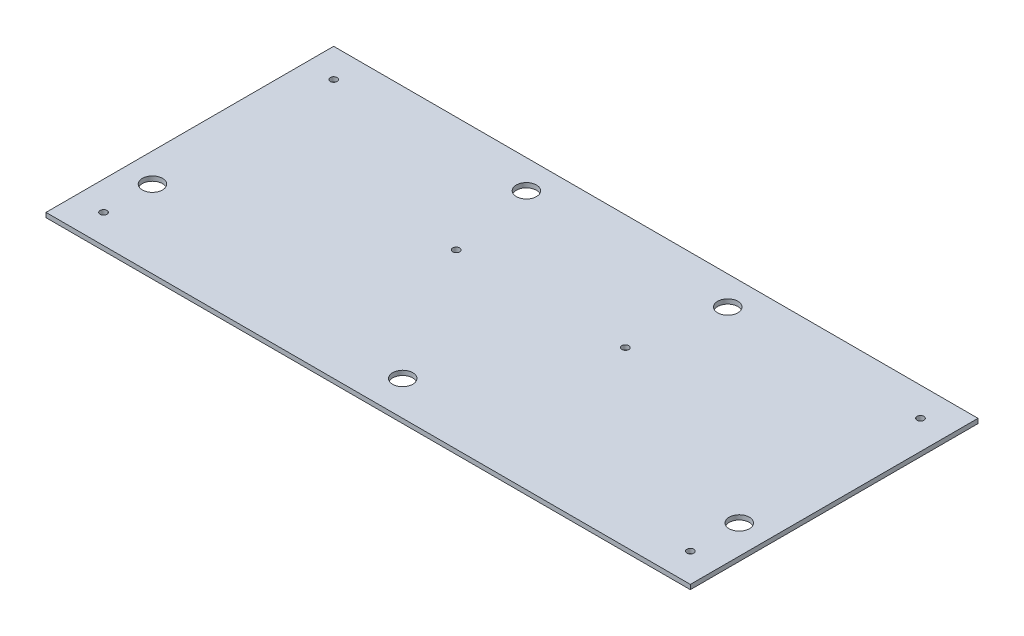
ISO-10303-21;
HEADER;
FILE_DESCRIPTION(('STEP AP214'),'2;1');
FILE_NAME('part.step','',(''),(''),'','','');
FILE_SCHEMA(('AUTOMOTIVE_DESIGN { 1 0 10303 214 1 1 1 1 }'));
ENDSEC;
DATA;
#1=APPLICATION_CONTEXT('core data for automotive mechanical design processes');
#2=APPLICATION_PROTOCOL_DEFINITION('international standard','automotive_design',2000,#1);
#3=PRODUCT_CONTEXT('',#1,'mechanical');
#4=PRODUCT('Part','Part','',(#3));
#5=PRODUCT_RELATED_PRODUCT_CATEGORY('part','',(#4));
#6=PRODUCT_DEFINITION_FORMATION('','',#4);
#7=PRODUCT_DEFINITION_CONTEXT('part definition',#1,'design');
#8=PRODUCT_DEFINITION('design','',#6,#7);
#9=PRODUCT_DEFINITION_SHAPE('','',#8);
#10=(LENGTH_UNIT() NAMED_UNIT(*) SI_UNIT(.MILLI.,.METRE.));
#11=(NAMED_UNIT(*) PLANE_ANGLE_UNIT() SI_UNIT($,.RADIAN.));
#12=(NAMED_UNIT(*) SI_UNIT($,.STERADIAN.) SOLID_ANGLE_UNIT());
#13=UNCERTAINTY_MEASURE_WITH_UNIT(LENGTH_MEASURE(1.E-05),#10,'distance_accuracy_value','');
#14=(GEOMETRIC_REPRESENTATION_CONTEXT(3) GLOBAL_UNCERTAINTY_ASSIGNED_CONTEXT((#13)) GLOBAL_UNIT_ASSIGNED_CONTEXT((#10,
#11,#12)) REPRESENTATION_CONTEXT('',''));
#15=CARTESIAN_POINT('',(0.,0.,0.));
#16=DIRECTION('',(0.,0.,1.));
#17=DIRECTION('',(1.,0.,0.));
#18=AXIS2_PLACEMENT_3D('',#15,#16,#17);
#19=CARTESIAN_POINT('',(-112.,1.6,50.));
#20=DIRECTION('',(1.,0.,0.));
#21=DIRECTION('',(0.,0.,-1.));
#22=AXIS2_PLACEMENT_3D('',#19,#20,#21);
#23=PLANE('',#22);
#24=DIRECTION('',(0.,0.,1.));
#25=VECTOR('',#24,1.);
#26=CARTESIAN_POINT('',(-112.,0.,50.));
#27=LINE('',#26,#25);
#28=CARTESIAN_POINT('',(-112.,0.,-50.));
#29=VERTEX_POINT('',#28);
#30=CARTESIAN_POINT('',(-112.,0.,50.));
#31=VERTEX_POINT('',#30);
#32=EDGE_CURVE('E108',#29,#31,#27,.T.);
#33=ORIENTED_EDGE('',*,*,#32,.T.);
#34=DIRECTION('',(0.,-1.,0.));
#35=VECTOR('',#34,1.);
#36=CARTESIAN_POINT('',(-112.,1.6,50.));
#37=LINE('',#36,#35);
#38=CARTESIAN_POINT('',(-112.,1.6,50.));
#39=VERTEX_POINT('',#38);
#40=EDGE_CURVE('E11',#39,#31,#37,.T.);
#41=ORIENTED_EDGE('',*,*,#40,.F.);
#42=DIRECTION('',(0.,0.,1.));
#43=VECTOR('',#42,1.);
#44=CARTESIAN_POINT('',(-112.,1.6,50.));
#45=LINE('',#44,#43);
#46=CARTESIAN_POINT('',(-112.,1.6,-50.));
#47=VERTEX_POINT('',#46);
#48=EDGE_CURVE('E96',#47,#39,#45,.T.);
#49=ORIENTED_EDGE('',*,*,#48,.F.);
#50=DIRECTION('',(0.,-1.,0.));
#51=VECTOR('',#50,1.);
#52=CARTESIAN_POINT('',(-112.,1.6,-50.));
#53=LINE('',#52,#51);
#54=EDGE_CURVE('E104',#47,#29,#53,.T.);
#55=ORIENTED_EDGE('',*,*,#54,.T.);
#56=EDGE_LOOP('',(#33,#41,#49,#55));
#57=FACE_BOUND('',#56,.T.);
#58=ADVANCED_FACE('F45',(#57),#23,.F.);
#59=CARTESIAN_POINT('',(112.,1.6,50.));
#60=DIRECTION('',(0.,0.,-1.));
#61=DIRECTION('',(-1.,0.,0.));
#62=AXIS2_PLACEMENT_3D('',#59,#60,#61);
#63=PLANE('',#62);
#64=DIRECTION('',(1.,0.,0.));
#65=VECTOR('',#64,1.);
#66=CARTESIAN_POINT('',(112.,0.,50.));
#67=LINE('',#66,#65);
#68=CARTESIAN_POINT('',(112.,0.,50.));
#69=VERTEX_POINT('',#68);
#70=EDGE_CURVE('E100',#31,#69,#67,.T.);
#71=ORIENTED_EDGE('',*,*,#70,.T.);
#72=DIRECTION('',(0.,-1.,0.));
#73=VECTOR('',#72,1.);
#74=CARTESIAN_POINT('',(112.,1.6,50.));
#75=LINE('',#74,#73);
#76=CARTESIAN_POINT('',(112.,1.6,50.));
#77=VERTEX_POINT('',#76);
#78=EDGE_CURVE('E53',#77,#69,#75,.T.);
#79=ORIENTED_EDGE('',*,*,#78,.F.);
#80=DIRECTION('',(1.,0.,0.));
#81=VECTOR('',#80,1.);
#82=CARTESIAN_POINT('',(112.,1.6,50.));
#83=LINE('',#82,#81);
#84=EDGE_CURVE('E91',#39,#77,#83,.T.);
#85=ORIENTED_EDGE('',*,*,#84,.F.);
#86=ORIENTED_EDGE('',*,*,#40,.T.);
#87=EDGE_LOOP('',(#71,#79,#85,#86));
#88=FACE_BOUND('',#87,.T.);
#89=ADVANCED_FACE('F99',(#88),#63,.F.);
#90=CARTESIAN_POINT('',(112.,1.6,50.));
#91=DIRECTION('',(-1.,0.,0.));
#92=DIRECTION('',(0.,0.,1.));
#93=AXIS2_PLACEMENT_3D('',#90,#91,#92);
#94=PLANE('',#93);
#95=DIRECTION('',(0.,0.,-1.));
#96=VECTOR('',#95,1.);
#97=CARTESIAN_POINT('',(112.,0.,50.));
#98=LINE('',#97,#96);
#99=CARTESIAN_POINT('',(112.,0.,-50.));
#100=VERTEX_POINT('',#99);
#101=EDGE_CURVE('E78',#69,#100,#98,.T.);
#102=ORIENTED_EDGE('',*,*,#101,.T.);
#103=DIRECTION('',(0.,-1.,0.));
#104=VECTOR('',#103,1.);
#105=CARTESIAN_POINT('',(112.,1.6,-50.));
#106=LINE('',#105,#104);
#107=CARTESIAN_POINT('',(112.,1.6,-50.));
#108=VERTEX_POINT('',#107);
#109=EDGE_CURVE('E101',#108,#100,#106,.T.);
#110=ORIENTED_EDGE('',*,*,#109,.F.);
#111=DIRECTION('',(0.,0.,-1.));
#112=VECTOR('',#111,1.);
#113=CARTESIAN_POINT('',(112.,1.6,50.));
#114=LINE('',#113,#112);
#115=EDGE_CURVE('E94',#77,#108,#114,.T.);
#116=ORIENTED_EDGE('',*,*,#115,.F.);
#117=ORIENTED_EDGE('',*,*,#78,.T.);
#118=EDGE_LOOP('',(#102,#110,#116,#117));
#119=FACE_BOUND('',#118,.T.);
#120=ADVANCED_FACE('F102',(#119),#94,.F.);
#121=CARTESIAN_POINT('',(112.,1.6,-50.));
#122=DIRECTION('',(0.,0.,1.));
#123=DIRECTION('',(1.,0.,0.));
#124=AXIS2_PLACEMENT_3D('',#121,#122,#123);
#125=PLANE('',#124);
#126=DIRECTION('',(-1.,0.,0.));
#127=VECTOR('',#126,1.);
#128=CARTESIAN_POINT('',(112.,0.,-50.));
#129=LINE('',#128,#127);
#130=EDGE_CURVE('E84',#100,#29,#129,.T.);
#131=ORIENTED_EDGE('',*,*,#130,.T.);
#132=ORIENTED_EDGE('',*,*,#54,.F.);
#133=DIRECTION('',(-1.,0.,0.));
#134=VECTOR('',#133,1.);
#135=CARTESIAN_POINT('',(112.,1.6,-50.));
#136=LINE('',#135,#134);
#137=EDGE_CURVE('E61',#108,#47,#136,.T.);
#138=ORIENTED_EDGE('',*,*,#137,.F.);
#139=ORIENTED_EDGE('',*,*,#109,.T.);
#140=EDGE_LOOP('',(#131,#132,#138,#139));
#141=FACE_BOUND('',#140,.T.);
#142=ADVANCED_FACE('F116',(#141),#125,.F.);
#143=CARTESIAN_POINT('',(0.,1.6,0.));
#144=DIRECTION('',(0.,1.,0.));
#145=DIRECTION('',(0.,0.,1.));
#146=AXIS2_PLACEMENT_3D('',#143,#144,#145);
#147=PLANE('',#146);
#148=CARTESIAN_POINT('',(-102.,1.6,23.));
#149=DIRECTION('',(0.,1.,0.));
#150=DIRECTION('',(0.,0.,1.));
#151=AXIS2_PLACEMENT_3D('',#148,#149,#150);
#152=CIRCLE('',#151,3.50000000000001);
#153=CARTESIAN_POINT('',(-102.,1.6,26.5));
#154=VERTEX_POINT('',#153);
#155=EDGE_CURVE('E175',#154,#154,#152,.F.);
#156=ORIENTED_EDGE('',*,*,#155,.T.);
#157=EDGE_LOOP('',(#156));
#158=FACE_BOUND('',#157,.T.);
#159=CARTESIAN_POINT('',(102.,1.6,23.));
#160=DIRECTION('',(0.,1.,0.));
#161=DIRECTION('',(0.,0.,1.));
#162=AXIS2_PLACEMENT_3D('',#159,#160,#161);
#163=CIRCLE('',#162,3.50000000000001);
#164=CARTESIAN_POINT('',(102.,1.6,26.5));
#165=VERTEX_POINT('',#164);
#166=EDGE_CURVE('E178',#165,#165,#163,.F.);
#167=ORIENTED_EDGE('',*,*,#166,.T.);
#168=EDGE_LOOP('',(#167));
#169=FACE_BOUND('',#168,.T.);
#170=CARTESIAN_POINT('',(-29.4129910363795,1.6,-10.));
#171=DIRECTION('',(0.,-1.,0.));
#172=DIRECTION('',(0.,0.,-1.));
#173=AXIS2_PLACEMENT_3D('',#170,#171,#172);
#174=CIRCLE('',#173,1.2);
#175=CARTESIAN_POINT('',(-29.4129910363795,1.6,-11.2));
#176=VERTEX_POINT('',#175);
#177=EDGE_CURVE('E169',#176,#176,#174,.T.);
#178=ORIENTED_EDGE('',*,*,#177,.T.);
#179=EDGE_LOOP('',(#178));
#180=FACE_BOUND('',#179,.T.);
#181=CARTESIAN_POINT('',(29.4129910363795,1.6,-10.));
#182=DIRECTION('',(0.,-1.,0.));
#183=DIRECTION('',(0.,0.,-1.));
#184=AXIS2_PLACEMENT_3D('',#181,#182,#183);
#185=CIRCLE('',#184,1.2);
#186=CARTESIAN_POINT('',(29.4129910363795,1.6,-11.2));
#187=VERTEX_POINT('',#186);
#188=EDGE_CURVE('E150',#187,#187,#185,.T.);
#189=ORIENTED_EDGE('',*,*,#188,.T.);
#190=EDGE_LOOP('',(#189));
#191=FACE_BOUND('',#190,.T.);
#192=CARTESIAN_POINT('',(-35.,1.6,-40.));
#193=DIRECTION('',(0.,1.,0.));
#194=DIRECTION('',(0.,0.,1.));
#195=AXIS2_PLACEMENT_3D('',#192,#193,#194);
#196=CIRCLE('',#195,3.5);
#197=CARTESIAN_POINT('',(-35.,1.6,-36.5));
#198=VERTEX_POINT('',#197);
#199=EDGE_CURVE('E145',#198,#198,#196,.T.);
#200=ORIENTED_EDGE('',*,*,#199,.F.);
#201=EDGE_LOOP('',(#200));
#202=FACE_BOUND('',#201,.T.);
#203=CARTESIAN_POINT('',(35.,1.6,-40.));
#204=DIRECTION('',(0.,1.,0.));
#205=DIRECTION('',(0.,0.,1.));
#206=AXIS2_PLACEMENT_3D('',#203,#204,#205);
#207=CIRCLE('',#206,3.5);
#208=CARTESIAN_POINT('',(35.,1.6,-36.5));
#209=VERTEX_POINT('',#208);
#210=EDGE_CURVE('E153',#209,#209,#207,.T.);
#211=ORIENTED_EDGE('',*,*,#210,.F.);
#212=EDGE_LOOP('',(#211));
#213=FACE_BOUND('',#212,.T.);
#214=CARTESIAN_POINT('',(0.,1.6,38.));
#215=DIRECTION('',(0.,1.,0.));
#216=DIRECTION('',(0.,0.,1.));
#217=AXIS2_PLACEMENT_3D('',#214,#215,#216);
#218=CIRCLE('',#217,3.5);
#219=CARTESIAN_POINT('',(0.,1.6,41.5));
#220=VERTEX_POINT('',#219);
#221=EDGE_CURVE('E146',#220,#220,#218,.T.);
#222=ORIENTED_EDGE('',*,*,#221,.F.);
#223=EDGE_LOOP('',(#222));
#224=FACE_BOUND('',#223,.T.);
#225=CARTESIAN_POINT('',(-102.,1.6,40.));
#226=DIRECTION('',(0.,-1.,0.));
#227=DIRECTION('',(0.,0.,-1.));
#228=AXIS2_PLACEMENT_3D('',#225,#226,#227);
#229=CIRCLE('',#228,1.19999999999999);
#230=CARTESIAN_POINT('',(-102.,1.6,38.8));
#231=VERTEX_POINT('',#230);
#232=EDGE_CURVE('E139',#231,#231,#229,.T.);
#233=ORIENTED_EDGE('',*,*,#232,.T.);
#234=EDGE_LOOP('',(#233));
#235=FACE_BOUND('',#234,.T.);
#236=CARTESIAN_POINT('',(102.,1.6,40.));
#237=DIRECTION('',(0.,-1.,0.));
#238=DIRECTION('',(0.,0.,-1.));
#239=AXIS2_PLACEMENT_3D('',#236,#237,#238);
#240=CIRCLE('',#239,1.19999999999999);
#241=CARTESIAN_POINT('',(102.,1.6,38.8));
#242=VERTEX_POINT('',#241);
#243=EDGE_CURVE('E133',#242,#242,#240,.T.);
#244=ORIENTED_EDGE('',*,*,#243,.T.);
#245=EDGE_LOOP('',(#244));
#246=FACE_BOUND('',#245,.T.);
#247=CARTESIAN_POINT('',(102.,1.6,-40.));
#248=DIRECTION('',(0.,-1.,0.));
#249=DIRECTION('',(0.,0.,-1.));
#250=AXIS2_PLACEMENT_3D('',#247,#248,#249);
#251=CIRCLE('',#250,1.19999999999999);
#252=CARTESIAN_POINT('',(102.,1.6,-41.2));
#253=VERTEX_POINT('',#252);
#254=EDGE_CURVE('E127',#253,#253,#251,.T.);
#255=ORIENTED_EDGE('',*,*,#254,.T.);
#256=EDGE_LOOP('',(#255));
#257=FACE_BOUND('',#256,.T.);
#258=CARTESIAN_POINT('',(-102.,1.6,-40.));
#259=DIRECTION('',(0.,-1.,0.));
#260=DIRECTION('',(0.,0.,-1.));
#261=AXIS2_PLACEMENT_3D('',#258,#259,#260);
#262=CIRCLE('',#261,1.19999999999999);
#263=CARTESIAN_POINT('',(-102.,1.6,-41.2));
#264=VERTEX_POINT('',#263);
#265=EDGE_CURVE('E111',#264,#264,#262,.T.);
#266=ORIENTED_EDGE('',*,*,#265,.T.);
#267=EDGE_LOOP('',(#266));
#268=FACE_BOUND('',#267,.T.);
#269=ORIENTED_EDGE('',*,*,#48,.T.);
#270=ORIENTED_EDGE('',*,*,#84,.T.);
#271=ORIENTED_EDGE('',*,*,#115,.T.);
#272=ORIENTED_EDGE('',*,*,#137,.T.);
#273=EDGE_LOOP('',(#269,#270,#271,#272));
#274=FACE_BOUND('',#273,.T.);
#275=ADVANCED_FACE('F92',(#158,#169,#180,#191,#202,#213,#224,#235,#246,#257,#268,#274),#147,.T.);
#276=CARTESIAN_POINT('',(0.,0.,0.));
#277=DIRECTION('',(0.,1.,0.));
#278=DIRECTION('',(0.,0.,1.));
#279=AXIS2_PLACEMENT_3D('',#276,#277,#278);
#280=PLANE('',#279);
#281=CARTESIAN_POINT('',(-102.,0.,23.));
#282=DIRECTION('',(0.,1.,0.));
#283=DIRECTION('',(0.,0.,1.));
#284=AXIS2_PLACEMENT_3D('',#281,#282,#283);
#285=CIRCLE('',#284,3.50000000000001);
#286=CARTESIAN_POINT('',(-102.,0.,26.5));
#287=VERTEX_POINT('',#286);
#288=EDGE_CURVE('E181',#287,#287,#285,.T.);
#289=ORIENTED_EDGE('',*,*,#288,.T.);
#290=EDGE_LOOP('',(#289));
#291=FACE_BOUND('',#290,.T.);
#292=CARTESIAN_POINT('',(102.,0.,23.));
#293=DIRECTION('',(0.,1.,0.));
#294=DIRECTION('',(0.,0.,1.));
#295=AXIS2_PLACEMENT_3D('',#292,#293,#294);
#296=CIRCLE('',#295,3.50000000000001);
#297=CARTESIAN_POINT('',(102.,0.,26.5));
#298=VERTEX_POINT('',#297);
#299=EDGE_CURVE('E182',#298,#298,#296,.T.);
#300=ORIENTED_EDGE('',*,*,#299,.T.);
#301=EDGE_LOOP('',(#300));
#302=FACE_BOUND('',#301,.T.);
#303=CARTESIAN_POINT('',(-29.4129910363795,0.,-10.));
#304=DIRECTION('',(0.,-1.,0.));
#305=DIRECTION('',(0.,0.,-1.));
#306=AXIS2_PLACEMENT_3D('',#303,#304,#305);
#307=CIRCLE('',#306,1.19999999999999);
#308=CARTESIAN_POINT('',(-29.4129910363795,0.,-11.2));
#309=VERTEX_POINT('',#308);
#310=EDGE_CURVE('E172',#309,#309,#307,.T.);
#311=ORIENTED_EDGE('',*,*,#310,.F.);
#312=EDGE_LOOP('',(#311));
#313=FACE_BOUND('',#312,.T.);
#314=CARTESIAN_POINT('',(29.4129910363795,0.,-10.));
#315=DIRECTION('',(0.,-1.,0.));
#316=DIRECTION('',(0.,0.,-1.));
#317=AXIS2_PLACEMENT_3D('',#314,#315,#316);
#318=CIRCLE('',#317,1.19999999999999);
#319=CARTESIAN_POINT('',(29.4129910363795,0.,-11.2));
#320=VERTEX_POINT('',#319);
#321=EDGE_CURVE('E166',#320,#320,#318,.T.);
#322=ORIENTED_EDGE('',*,*,#321,.F.);
#323=EDGE_LOOP('',(#322));
#324=FACE_BOUND('',#323,.T.);
#325=CARTESIAN_POINT('',(-35.,0.,-40.));
#326=DIRECTION('',(0.,1.,0.));
#327=DIRECTION('',(0.,0.,1.));
#328=AXIS2_PLACEMENT_3D('',#325,#326,#327);
#329=CIRCLE('',#328,3.5);
#330=CARTESIAN_POINT('',(-35.,0.,-36.5));
#331=VERTEX_POINT('',#330);
#332=EDGE_CURVE('E159',#331,#331,#329,.T.);
#333=ORIENTED_EDGE('',*,*,#332,.T.);
#334=EDGE_LOOP('',(#333));
#335=FACE_BOUND('',#334,.T.);
#336=CARTESIAN_POINT('',(35.,0.,-40.));
#337=DIRECTION('',(0.,1.,0.));
#338=DIRECTION('',(0.,0.,1.));
#339=AXIS2_PLACEMENT_3D('',#336,#337,#338);
#340=CIRCLE('',#339,3.5);
#341=CARTESIAN_POINT('',(35.,0.,-36.5));
#342=VERTEX_POINT('',#341);
#343=EDGE_CURVE('E156',#342,#342,#340,.T.);
#344=ORIENTED_EDGE('',*,*,#343,.T.);
#345=EDGE_LOOP('',(#344));
#346=FACE_BOUND('',#345,.T.);
#347=CARTESIAN_POINT('',(0.,0.,38.));
#348=DIRECTION('',(0.,1.,0.));
#349=DIRECTION('',(0.,0.,1.));
#350=AXIS2_PLACEMENT_3D('',#347,#348,#349);
#351=CIRCLE('',#350,3.5);
#352=CARTESIAN_POINT('',(0.,0.,41.5));
#353=VERTEX_POINT('',#352);
#354=EDGE_CURVE('E149',#353,#353,#351,.T.);
#355=ORIENTED_EDGE('',*,*,#354,.T.);
#356=EDGE_LOOP('',(#355));
#357=FACE_BOUND('',#356,.T.);
#358=CARTESIAN_POINT('',(-102.,0.,40.));
#359=DIRECTION('',(0.,-1.,0.));
#360=DIRECTION('',(0.,0.,-1.));
#361=AXIS2_PLACEMENT_3D('',#358,#359,#360);
#362=CIRCLE('',#361,1.19999999999999);
#363=CARTESIAN_POINT('',(-102.,0.,38.8));
#364=VERTEX_POINT('',#363);
#365=EDGE_CURVE('E142',#364,#364,#362,.T.);
#366=ORIENTED_EDGE('',*,*,#365,.F.);
#367=EDGE_LOOP('',(#366));
#368=FACE_BOUND('',#367,.T.);
#369=CARTESIAN_POINT('',(102.,0.,40.));
#370=DIRECTION('',(0.,-1.,0.));
#371=DIRECTION('',(0.,0.,-1.));
#372=AXIS2_PLACEMENT_3D('',#369,#370,#371);
#373=CIRCLE('',#372,1.19999999999999);
#374=CARTESIAN_POINT('',(102.,0.,38.8));
#375=VERTEX_POINT('',#374);
#376=EDGE_CURVE('E136',#375,#375,#373,.T.);
#377=ORIENTED_EDGE('',*,*,#376,.F.);
#378=EDGE_LOOP('',(#377));
#379=FACE_BOUND('',#378,.T.);
#380=CARTESIAN_POINT('',(102.,0.,-40.));
#381=DIRECTION('',(0.,-1.,0.));
#382=DIRECTION('',(0.,0.,-1.));
#383=AXIS2_PLACEMENT_3D('',#380,#381,#382);
#384=CIRCLE('',#383,1.19999999999999);
#385=CARTESIAN_POINT('',(102.,0.,-41.2));
#386=VERTEX_POINT('',#385);
#387=EDGE_CURVE('E130',#386,#386,#384,.T.);
#388=ORIENTED_EDGE('',*,*,#387,.F.);
#389=EDGE_LOOP('',(#388));
#390=FACE_BOUND('',#389,.T.);
#391=CARTESIAN_POINT('',(-102.,0.,-40.));
#392=DIRECTION('',(0.,-1.,0.));
#393=DIRECTION('',(0.,0.,-1.));
#394=AXIS2_PLACEMENT_3D('',#391,#392,#393);
#395=CIRCLE('',#394,1.19999999999999);
#396=CARTESIAN_POINT('',(-102.,0.,-41.2));
#397=VERTEX_POINT('',#396);
#398=EDGE_CURVE('E124',#397,#397,#395,.T.);
#399=ORIENTED_EDGE('',*,*,#398,.F.);
#400=EDGE_LOOP('',(#399));
#401=FACE_BOUND('',#400,.T.);
#402=ORIENTED_EDGE('',*,*,#32,.F.);
#403=ORIENTED_EDGE('',*,*,#130,.F.);
#404=ORIENTED_EDGE('',*,*,#101,.F.);
#405=ORIENTED_EDGE('',*,*,#70,.F.);
#406=EDGE_LOOP('',(#402,#403,#404,#405));
#407=FACE_BOUND('',#406,.T.);
#408=ADVANCED_FACE('F119',(#291,#302,#313,#324,#335,#346,#357,#368,#379,#390,#401,#407),#280,.F.);
#409=CARTESIAN_POINT('',(-102.,0.,-40.));
#410=DIRECTION('',(0.,-1.,0.));
#411=DIRECTION('',(0.,0.,-1.));
#412=AXIS2_PLACEMENT_3D('',#409,#410,#411);
#413=CYLINDRICAL_SURFACE('',#412,1.19999999999999);
#414=ORIENTED_EDGE('',*,*,#265,.F.);
#415=EDGE_LOOP('',(#414));
#416=FACE_BOUND('',#415,.T.);
#417=ORIENTED_EDGE('',*,*,#398,.T.);
#418=EDGE_LOOP('',(#417));
#419=FACE_BOUND('',#418,.T.);
#420=ADVANCED_FACE('F215',(#416,#419),#413,.F.);
#421=CARTESIAN_POINT('',(102.,0.,-40.));
#422=DIRECTION('',(0.,-1.,0.));
#423=DIRECTION('',(0.,0.,-1.));
#424=AXIS2_PLACEMENT_3D('',#421,#422,#423);
#425=CYLINDRICAL_SURFACE('',#424,1.19999999999999);
#426=ORIENTED_EDGE('',*,*,#254,.F.);
#427=EDGE_LOOP('',(#426));
#428=FACE_BOUND('',#427,.T.);
#429=ORIENTED_EDGE('',*,*,#387,.T.);
#430=EDGE_LOOP('',(#429));
#431=FACE_BOUND('',#430,.T.);
#432=ADVANCED_FACE('F221',(#428,#431),#425,.F.);
#433=CARTESIAN_POINT('',(102.,0.,40.));
#434=DIRECTION('',(0.,-1.,0.));
#435=DIRECTION('',(0.,0.,-1.));
#436=AXIS2_PLACEMENT_3D('',#433,#434,#435);
#437=CYLINDRICAL_SURFACE('',#436,1.19999999999999);
#438=ORIENTED_EDGE('',*,*,#243,.F.);
#439=EDGE_LOOP('',(#438));
#440=FACE_BOUND('',#439,.T.);
#441=ORIENTED_EDGE('',*,*,#376,.T.);
#442=EDGE_LOOP('',(#441));
#443=FACE_BOUND('',#442,.T.);
#444=ADVANCED_FACE('F225',(#440,#443),#437,.F.);
#445=CARTESIAN_POINT('',(-102.,0.,40.));
#446=DIRECTION('',(0.,-1.,0.));
#447=DIRECTION('',(0.,0.,-1.));
#448=AXIS2_PLACEMENT_3D('',#445,#446,#447);
#449=CYLINDRICAL_SURFACE('',#448,1.19999999999999);
#450=ORIENTED_EDGE('',*,*,#232,.F.);
#451=EDGE_LOOP('',(#450));
#452=FACE_BOUND('',#451,.T.);
#453=ORIENTED_EDGE('',*,*,#365,.T.);
#454=EDGE_LOOP('',(#453));
#455=FACE_BOUND('',#454,.T.);
#456=ADVANCED_FACE('F229',(#452,#455),#449,.F.);
#457=CARTESIAN_POINT('',(0.,1.6,38.));
#458=DIRECTION('',(0.,-1.,0.));
#459=DIRECTION('',(0.,0.,-1.));
#460=AXIS2_PLACEMENT_3D('',#457,#458,#459);
#461=CYLINDRICAL_SURFACE('',#460,3.5);
#462=ORIENTED_EDGE('',*,*,#221,.T.);
#463=EDGE_LOOP('',(#462));
#464=FACE_BOUND('',#463,.T.);
#465=ORIENTED_EDGE('',*,*,#354,.F.);
#466=EDGE_LOOP('',(#465));
#467=FACE_BOUND('',#466,.T.);
#468=ADVANCED_FACE('F233',(#464,#467),#461,.F.);
#469=CARTESIAN_POINT('',(35.,1.6,-40.));
#470=DIRECTION('',(0.,-1.,0.));
#471=DIRECTION('',(0.,0.,-1.));
#472=AXIS2_PLACEMENT_3D('',#469,#470,#471);
#473=CYLINDRICAL_SURFACE('',#472,3.5);
#474=ORIENTED_EDGE('',*,*,#210,.T.);
#475=EDGE_LOOP('',(#474));
#476=FACE_BOUND('',#475,.T.);
#477=ORIENTED_EDGE('',*,*,#343,.F.);
#478=EDGE_LOOP('',(#477));
#479=FACE_BOUND('',#478,.T.);
#480=ADVANCED_FACE('F237',(#476,#479),#473,.F.);
#481=CARTESIAN_POINT('',(-35.,1.6,-40.));
#482=DIRECTION('',(0.,-1.,0.));
#483=DIRECTION('',(0.,0.,-1.));
#484=AXIS2_PLACEMENT_3D('',#481,#482,#483);
#485=CYLINDRICAL_SURFACE('',#484,3.5);
#486=ORIENTED_EDGE('',*,*,#199,.T.);
#487=EDGE_LOOP('',(#486));
#488=FACE_BOUND('',#487,.T.);
#489=ORIENTED_EDGE('',*,*,#332,.F.);
#490=EDGE_LOOP('',(#489));
#491=FACE_BOUND('',#490,.T.);
#492=ADVANCED_FACE('F241',(#488,#491),#485,.F.);
#493=CARTESIAN_POINT('',(29.4129910363795,0.,-10.));
#494=DIRECTION('',(0.,-1.,0.));
#495=DIRECTION('',(0.,0.,-1.));
#496=AXIS2_PLACEMENT_3D('',#493,#494,#495);
#497=CYLINDRICAL_SURFACE('',#496,1.19999999999999);
#498=ORIENTED_EDGE('',*,*,#188,.F.);
#499=EDGE_LOOP('',(#498));
#500=FACE_BOUND('',#499,.T.);
#501=ORIENTED_EDGE('',*,*,#321,.T.);
#502=EDGE_LOOP('',(#501));
#503=FACE_BOUND('',#502,.T.);
#504=ADVANCED_FACE('F245',(#500,#503),#497,.F.);
#505=CARTESIAN_POINT('',(-29.4129910363795,0.,-10.));
#506=DIRECTION('',(0.,-1.,0.));
#507=DIRECTION('',(0.,0.,-1.));
#508=AXIS2_PLACEMENT_3D('',#505,#506,#507);
#509=CYLINDRICAL_SURFACE('',#508,1.19999999999999);
#510=ORIENTED_EDGE('',*,*,#177,.F.);
#511=EDGE_LOOP('',(#510));
#512=FACE_BOUND('',#511,.T.);
#513=ORIENTED_EDGE('',*,*,#310,.T.);
#514=EDGE_LOOP('',(#513));
#515=FACE_BOUND('',#514,.T.);
#516=ADVANCED_FACE('F198',(#512,#515),#509,.F.);
#517=CARTESIAN_POINT('',(102.,2.,23.));
#518=DIRECTION('',(0.,-1.,0.));
#519=DIRECTION('',(0.,0.,-1.));
#520=AXIS2_PLACEMENT_3D('',#517,#518,#519);
#521=CYLINDRICAL_SURFACE('',#520,3.50000000000001);
#522=ORIENTED_EDGE('',*,*,#166,.F.);
#523=EDGE_LOOP('',(#522));
#524=FACE_BOUND('',#523,.T.);
#525=ORIENTED_EDGE('',*,*,#299,.F.);
#526=EDGE_LOOP('',(#525));
#527=FACE_BOUND('',#526,.T.);
#528=ADVANCED_FACE('F192',(#524,#527),#521,.F.);
#529=CARTESIAN_POINT('',(-102.,2.,23.));
#530=DIRECTION('',(0.,-1.,0.));
#531=DIRECTION('',(0.,0.,-1.));
#532=AXIS2_PLACEMENT_3D('',#529,#530,#531);
#533=CYLINDRICAL_SURFACE('',#532,3.50000000000001);
#534=ORIENTED_EDGE('',*,*,#155,.F.);
#535=EDGE_LOOP('',(#534));
#536=FACE_BOUND('',#535,.T.);
#537=ORIENTED_EDGE('',*,*,#288,.F.);
#538=EDGE_LOOP('',(#537));
#539=FACE_BOUND('',#538,.T.);
#540=ADVANCED_FACE('F190',(#536,#539),#533,.F.);
#541=CLOSED_SHELL('',(#58,#89,#120,#142,#275,#408,#420,#432,#444,#456,#468,#480,#492,#504,#516,
#528,#540));
#542=MANIFOLD_SOLID_BREP('B2',#541);
#543=ADVANCED_BREP_SHAPE_REPRESENTATION('',(#18,#542),#14);
#544=SHAPE_DEFINITION_REPRESENTATION(#9,#543);
ENDSEC;
END-ISO-10303-21;
